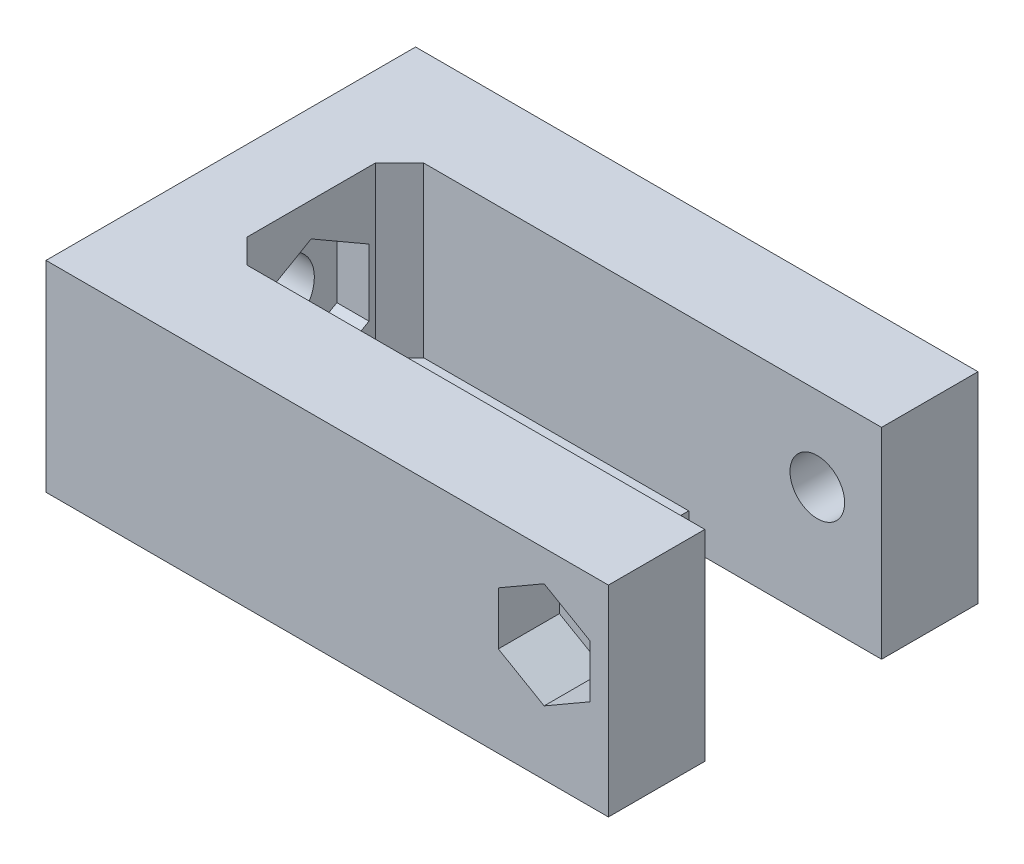
ISO-10303-21;
HEADER;
FILE_DESCRIPTION(('STEP AP214'),'2;1');
FILE_NAME('part.step','',(''),(''),'','','');
FILE_SCHEMA(('AUTOMOTIVE_DESIGN { 1 0 10303 214 1 1 1 1 }'));
ENDSEC;
DATA;
#1=APPLICATION_CONTEXT('core data for automotive mechanical design processes');
#2=APPLICATION_PROTOCOL_DEFINITION('international standard','automotive_design',2000,#1);
#3=PRODUCT_CONTEXT('',#1,'mechanical');
#4=PRODUCT('Part','Part','',(#3));
#5=PRODUCT_RELATED_PRODUCT_CATEGORY('part','',(#4));
#6=PRODUCT_DEFINITION_FORMATION('','',#4);
#7=PRODUCT_DEFINITION_CONTEXT('part definition',#1,'design');
#8=PRODUCT_DEFINITION('design','',#6,#7);
#9=PRODUCT_DEFINITION_SHAPE('','',#8);
#10=(LENGTH_UNIT() NAMED_UNIT(*) SI_UNIT(.MILLI.,.METRE.));
#11=(NAMED_UNIT(*) PLANE_ANGLE_UNIT() SI_UNIT($,.RADIAN.));
#12=(NAMED_UNIT(*) SI_UNIT($,.STERADIAN.) SOLID_ANGLE_UNIT());
#13=UNCERTAINTY_MEASURE_WITH_UNIT(LENGTH_MEASURE(1.E-05),#10,'distance_accuracy_value','');
#14=(GEOMETRIC_REPRESENTATION_CONTEXT(3) GLOBAL_UNCERTAINTY_ASSIGNED_CONTEXT((#13)) GLOBAL_UNIT_ASSIGNED_CONTEXT((#10,
#11,#12)) REPRESENTATION_CONTEXT('',''));
#15=CARTESIAN_POINT('',(0.,0.,0.));
#16=DIRECTION('',(0.,0.,1.));
#17=DIRECTION('',(1.,0.,0.));
#18=AXIS2_PLACEMENT_3D('',#15,#16,#17);
#19=CARTESIAN_POINT('',(5.,0.,0.));
#20=DIRECTION('',(-1.,0.,0.));
#21=DIRECTION('',(0.,0.,1.));
#22=AXIS2_PLACEMENT_3D('',#19,#20,#21);
#23=PLANE('',#22);
#24=DIRECTION('',(0.,-1.,0.));
#25=VECTOR('',#24,1.);
#26=CARTESIAN_POINT('',(5.,8.32846096908265,-7.9));
#27=LINE('',#26,#25);
#28=CARTESIAN_POINT('',(5.,8.32846096908265,-7.9));
#29=VERTEX_POINT('',#28);
#30=CARTESIAN_POINT('',(5.,4.17153903091735,-7.9));
#31=VERTEX_POINT('',#30);
#32=EDGE_CURVE('E301',#29,#31,#27,.T.);
#33=ORIENTED_EDGE('',*,*,#32,.F.);
#34=DIRECTION('',(0.,-0.5,0.866025403784439));
#35=VECTOR('',#34,1.);
#36=CARTESIAN_POINT('',(5.,10.4069219381653,-11.5));
#37=LINE('',#36,#35);
#38=CARTESIAN_POINT('',(5.,10.4069219381653,-11.5));
#39=VERTEX_POINT('',#38);
#40=EDGE_CURVE('E299',#39,#29,#37,.T.);
#41=ORIENTED_EDGE('',*,*,#40,.F.);
#42=DIRECTION('',(0.,0.5,0.866025403784438));
#43=VECTOR('',#42,1.);
#44=CARTESIAN_POINT('',(5.,8.32846096908265,-15.1));
#45=LINE('',#44,#43);
#46=CARTESIAN_POINT('',(5.,8.32846096908265,-15.1));
#47=VERTEX_POINT('',#46);
#48=EDGE_CURVE('E283',#47,#39,#45,.T.);
#49=ORIENTED_EDGE('',*,*,#48,.F.);
#50=DIRECTION('',(0.,1.,0.));
#51=VECTOR('',#50,1.);
#52=CARTESIAN_POINT('',(5.,4.17153903091735,-15.1));
#53=LINE('',#52,#51);
#54=CARTESIAN_POINT('',(5.,4.17153903091735,-15.1));
#55=VERTEX_POINT('',#54);
#56=EDGE_CURVE('E310',#55,#47,#53,.T.);
#57=ORIENTED_EDGE('',*,*,#56,.F.);
#58=DIRECTION('',(0.,0.5,-0.866025403784439));
#59=VECTOR('',#58,1.);
#60=CARTESIAN_POINT('',(5.,2.09307806183469,-11.5));
#61=LINE('',#60,#59);
#62=CARTESIAN_POINT('',(5.,2.09307806183469,-11.5));
#63=VERTEX_POINT('',#62);
#64=EDGE_CURVE('E307',#63,#55,#61,.T.);
#65=ORIENTED_EDGE('',*,*,#64,.F.);
#66=DIRECTION('',(0.,-0.5,-0.866025403784438));
#67=VECTOR('',#66,1.);
#68=CARTESIAN_POINT('',(5.,4.17153903091735,-7.9));
#69=LINE('',#68,#67);
#70=EDGE_CURVE('E304',#31,#63,#69,.T.);
#71=ORIENTED_EDGE('',*,*,#70,.F.);
#72=EDGE_LOOP('',(#33,#41,#49,#57,#65,#71));
#73=FACE_BOUND('',#72,.T.);
#74=DIRECTION('',(0.,0.,1.));
#75=VECTOR('',#74,1.);
#76=CARTESIAN_POINT('',(5.,12.5,-6.));
#77=LINE('',#76,#75);
#78=CARTESIAN_POINT('',(5.,12.5,-15.5));
#79=VERTEX_POINT('',#78);
#80=CARTESIAN_POINT('',(5.,12.5,-7.50000000000001));
#81=VERTEX_POINT('',#80);
#82=EDGE_CURVE('E341',#79,#81,#77,.T.);
#83=ORIENTED_EDGE('',*,*,#82,.T.);
#84=DIRECTION('',(0.,-1.,0.));
#85=VECTOR('',#84,1.);
#86=CARTESIAN_POINT('',(5.,2.,-7.50000000000001));
#87=LINE('',#86,#85);
#88=CARTESIAN_POINT('',(5.,2.,-7.50000000000002));
#89=VERTEX_POINT('',#88);
#90=EDGE_CURVE('E395',#81,#89,#87,.T.);
#91=ORIENTED_EDGE('',*,*,#90,.T.);
#92=DIRECTION('',(0.,0.,1.));
#93=VECTOR('',#92,1.);
#94=CARTESIAN_POINT('',(5.,2.,-35.1107702762748));
#95=LINE('',#94,#93);
#96=CARTESIAN_POINT('',(5.,2.,-15.5));
#97=VERTEX_POINT('',#96);
#98=EDGE_CURVE('E205',#97,#89,#95,.T.);
#99=ORIENTED_EDGE('',*,*,#98,.F.);
#100=DIRECTION('',(0.,1.,0.));
#101=VECTOR('',#100,1.);
#102=CARTESIAN_POINT('',(5.,12.5,-15.5));
#103=LINE('',#102,#101);
#104=EDGE_CURVE('E384',#97,#79,#103,.T.);
#105=ORIENTED_EDGE('',*,*,#104,.T.);
#106=EDGE_LOOP('',(#83,#91,#99,#105));
#107=FACE_BOUND('',#106,.T.);
#108=ADVANCED_FACE('F36',(#73,#107),#23,.F.);
#109=CARTESIAN_POINT('',(-16.6508258053467,12.5,-17.));
#110=DIRECTION('',(0.,0.,-1.));
#111=DIRECTION('',(-1.,0.,0.));
#112=AXIS2_PLACEMENT_3D('',#109,#110,#111);
#113=PLANE('',#112);
#114=CARTESIAN_POINT('',(31.,7.28,-17.));
#115=DIRECTION('',(0.,0.,-1.));
#116=DIRECTION('',(-1.,0.,0.));
#117=AXIS2_PLACEMENT_3D('',#114,#115,#116);
#118=CIRCLE('',#117,1.7);
#119=CARTESIAN_POINT('',(29.3,7.28,-17.));
#120=VERTEX_POINT('',#119);
#121=EDGE_CURVE('E332',#120,#120,#118,.T.);
#122=ORIENTED_EDGE('',*,*,#121,.T.);
#123=EDGE_LOOP('',(#122));
#124=FACE_BOUND('',#123,.T.);
#125=DIRECTION('',(1.,0.,0.));
#126=VECTOR('',#125,1.);
#127=CARTESIAN_POINT('',(-16.6508258053467,12.5,-17.));
#128=LINE('',#127,#126);
#129=CARTESIAN_POINT('',(6.49999999999999,12.5,-17.));
#130=VERTEX_POINT('',#129);
#131=CARTESIAN_POINT('',(35.,12.5,-17.));
#132=VERTEX_POINT('',#131);
#133=EDGE_CURVE('E345',#130,#132,#128,.T.);
#134=ORIENTED_EDGE('',*,*,#133,.F.);
#135=DIRECTION('',(0.,-1.,0.));
#136=VECTOR('',#135,1.);
#137=CARTESIAN_POINT('',(6.49999999999999,2.,-17.));
#138=LINE('',#137,#136);
#139=CARTESIAN_POINT('',(6.49999999999999,2.,-17.));
#140=VERTEX_POINT('',#139);
#141=EDGE_CURVE('E402',#130,#140,#138,.T.);
#142=ORIENTED_EDGE('',*,*,#141,.T.);
#143=DIRECTION('',(1.,0.,0.));
#144=VECTOR('',#143,1.);
#145=CARTESIAN_POINT('',(23.,2.,-17.));
#146=LINE('',#145,#144);
#147=CARTESIAN_POINT('',(23.,2.,-17.));
#148=VERTEX_POINT('',#147);
#149=EDGE_CURVE('E204',#140,#148,#146,.T.);
#150=ORIENTED_EDGE('',*,*,#149,.T.);
#151=DIRECTION('',(0.,-1.,0.));
#152=VECTOR('',#151,1.);
#153=CARTESIAN_POINT('',(23.,0.,-17.));
#154=LINE('',#153,#152);
#155=CARTESIAN_POINT('',(23.,0.,-17.));
#156=VERTEX_POINT('',#155);
#157=EDGE_CURVE('E218',#148,#156,#154,.T.);
#158=ORIENTED_EDGE('',*,*,#157,.T.);
#159=DIRECTION('',(1.,0.,0.));
#160=VECTOR('',#159,1.);
#161=CARTESIAN_POINT('',(-16.6508258053467,0.,-17.));
#162=LINE('',#161,#160);
#163=CARTESIAN_POINT('',(35.,0.,-17.));
#164=VERTEX_POINT('',#163);
#165=EDGE_CURVE('E339',#156,#164,#162,.T.);
#166=ORIENTED_EDGE('',*,*,#165,.T.);
#167=DIRECTION('',(0.,1.,0.));
#168=VECTOR('',#167,1.);
#169=CARTESIAN_POINT('',(35.,12.5,-17.));
#170=LINE('',#169,#168);
#171=EDGE_CURVE('E336',#164,#132,#170,.T.);
#172=ORIENTED_EDGE('',*,*,#171,.T.);
#173=EDGE_LOOP('',(#134,#142,#150,#158,#166,#172));
#174=FACE_BOUND('',#173,.T.);
#175=ADVANCED_FACE('F421',(#124,#174),#113,.F.);
#176=CARTESIAN_POINT('',(-16.6508258053467,12.5,-6.));
#177=DIRECTION('',(0.,0.,1.));
#178=DIRECTION('',(0.,-1.,0.));
#179=AXIS2_PLACEMENT_3D('',#176,#177,#178);
#180=PLANE('',#179);
#181=CARTESIAN_POINT('',(31.,7.27999999999999,-6.));
#182=DIRECTION('',(0.,0.,1.));
#183=DIRECTION('',(0.,-1.,0.));
#184=AXIS2_PLACEMENT_3D('',#181,#182,#183);
#185=CIRCLE('',#184,1.7);
#186=CARTESIAN_POINT('',(31.,5.57999999999999,-6.));
#187=VERTEX_POINT('',#186);
#188=EDGE_CURVE('E331',#187,#187,#185,.T.);
#189=ORIENTED_EDGE('',*,*,#188,.T.);
#190=EDGE_LOOP('',(#189));
#191=FACE_BOUND('',#190,.T.);
#192=DIRECTION('',(1.,0.,0.));
#193=VECTOR('',#192,1.);
#194=CARTESIAN_POINT('',(23.,2.,-6.));
#195=LINE('',#194,#193);
#196=CARTESIAN_POINT('',(6.5,2.,-6.));
#197=VERTEX_POINT('',#196);
#198=CARTESIAN_POINT('',(23.,2.,-6.));
#199=VERTEX_POINT('',#198);
#200=EDGE_CURVE('E195',#197,#199,#195,.T.);
#201=ORIENTED_EDGE('',*,*,#200,.F.);
#202=DIRECTION('',(0.,1.,0.));
#203=VECTOR('',#202,1.);
#204=CARTESIAN_POINT('',(6.5,12.5,-6.));
#205=LINE('',#204,#203);
#206=CARTESIAN_POINT('',(6.5,12.5,-6.));
#207=VERTEX_POINT('',#206);
#208=EDGE_CURVE('E57',#197,#207,#205,.T.);
#209=ORIENTED_EDGE('',*,*,#208,.T.);
#210=DIRECTION('',(1.,0.,0.));
#211=VECTOR('',#210,1.);
#212=CARTESIAN_POINT('',(-16.6508258053467,12.5,-6.));
#213=LINE('',#212,#211);
#214=CARTESIAN_POINT('',(35.,12.5,-6.));
#215=VERTEX_POINT('',#214);
#216=EDGE_CURVE('E344',#207,#215,#213,.T.);
#217=ORIENTED_EDGE('',*,*,#216,.T.);
#218=DIRECTION('',(0.,-1.,0.));
#219=VECTOR('',#218,1.);
#220=CARTESIAN_POINT('',(35.,12.5,-6.));
#221=LINE('',#220,#219);
#222=CARTESIAN_POINT('',(35.,0.,-6.));
#223=VERTEX_POINT('',#222);
#224=EDGE_CURVE('E335',#215,#223,#221,.T.);
#225=ORIENTED_EDGE('',*,*,#224,.T.);
#226=DIRECTION('',(1.,0.,0.));
#227=VECTOR('',#226,1.);
#228=CARTESIAN_POINT('',(-16.6508258053467,0.,-6.));
#229=LINE('',#228,#227);
#230=CARTESIAN_POINT('',(23.,0.,-6.));
#231=VERTEX_POINT('',#230);
#232=EDGE_CURVE('E211',#231,#223,#229,.T.);
#233=ORIENTED_EDGE('',*,*,#232,.F.);
#234=DIRECTION('',(0.,-1.,0.));
#235=VECTOR('',#234,1.);
#236=CARTESIAN_POINT('',(23.,0.,-6.));
#237=LINE('',#236,#235);
#238=EDGE_CURVE('E208',#199,#231,#237,.T.);
#239=ORIENTED_EDGE('',*,*,#238,.F.);
#240=EDGE_LOOP('',(#201,#209,#217,#225,#233,#239));
#241=FACE_BOUND('',#240,.T.);
#242=ADVANCED_FACE('F209',(#191,#241),#180,.F.);
#243=CARTESIAN_POINT('',(31.,7.27999999999999,0.));
#244=DIRECTION('',(0.,0.,-1.));
#245=DIRECTION('',(0.,1.,0.));
#246=AXIS2_PLACEMENT_3D('',#243,#244,#245);
#247=CYLINDRICAL_SURFACE('',#246,1.7);
#248=ORIENTED_EDGE('',*,*,#188,.F.);
#249=EDGE_LOOP('',(#248));
#250=FACE_BOUND('',#249,.T.);
#251=CARTESIAN_POINT('',(31.,7.27999999999999,-3.8));
#252=DIRECTION('',(0.,0.,1.));
#253=DIRECTION('',(1.,0.,0.));
#254=AXIS2_PLACEMENT_3D('',#251,#252,#253);
#255=CIRCLE('',#254,1.7);
#256=CARTESIAN_POINT('',(32.7,7.27999999999999,-3.8));
#257=VERTEX_POINT('',#256);
#258=EDGE_CURVE('E261',#257,#257,#255,.F.);
#259=ORIENTED_EDGE('',*,*,#258,.F.);
#260=EDGE_LOOP('',(#259));
#261=FACE_BOUND('',#260,.T.);
#262=ADVANCED_FACE('F513',(#250,#261),#247,.F.);
#263=ORIENTED_EDGE('',*,*,#121,.F.);
#264=EDGE_LOOP('',(#263));
#265=FACE_BOUND('',#264,.T.);
#266=CARTESIAN_POINT('',(31.,7.28,-20.5));
#267=DIRECTION('',(0.,0.,-1.));
#268=DIRECTION('',(-1.,0.,0.));
#269=AXIS2_PLACEMENT_3D('',#266,#267,#268);
#270=CIRCLE('',#269,1.7);
#271=CARTESIAN_POINT('',(29.3,7.28,-20.5));
#272=VERTEX_POINT('',#271);
#273=EDGE_CURVE('E275',#272,#272,#270,.F.);
#274=ORIENTED_EDGE('',*,*,#273,.F.);
#275=EDGE_LOOP('',(#274));
#276=FACE_BOUND('',#275,.T.);
#277=ADVANCED_FACE('F515',(#265,#276),#247,.F.);
#278=CARTESIAN_POINT('',(10.,6.25,-11.5));
#279=DIRECTION('',(-1.,0.,0.));
#280=DIRECTION('',(0.,0.,1.));
#281=AXIS2_PLACEMENT_3D('',#278,#279,#280);
#282=CYLINDRICAL_SURFACE('',#281,2.2);
#283=CARTESIAN_POINT('',(0.,6.25,-11.5));
#284=DIRECTION('',(-1.,0.,0.));
#285=DIRECTION('',(0.,0.,1.));
#286=AXIS2_PLACEMENT_3D('',#283,#284,#285);
#287=CIRCLE('',#286,2.2);
#288=CARTESIAN_POINT('',(0.,6.25,-9.3));
#289=VERTEX_POINT('',#288);
#290=EDGE_CURVE('E328',#289,#289,#287,.T.);
#291=ORIENTED_EDGE('',*,*,#290,.T.);
#292=EDGE_LOOP('',(#291));
#293=FACE_BOUND('',#292,.T.);
#294=CARTESIAN_POINT('',(3.,6.25,-11.5));
#295=DIRECTION('',(1.,0.,0.));
#296=DIRECTION('',(0.,0.,-1.));
#297=AXIS2_PLACEMENT_3D('',#294,#295,#296);
#298=CIRCLE('',#297,2.2);
#299=CARTESIAN_POINT('',(3.,6.25,-13.7));
#300=VERTEX_POINT('',#299);
#301=EDGE_CURVE('E317',#300,#300,#298,.F.);
#302=ORIENTED_EDGE('',*,*,#301,.F.);
#303=EDGE_LOOP('',(#302));
#304=FACE_BOUND('',#303,.T.);
#305=ADVANCED_FACE('F457',(#293,#304),#282,.F.);
#306=CARTESIAN_POINT('',(35.,0.,0.));
#307=DIRECTION('',(-1.,0.,0.));
#308=DIRECTION('',(0.,0.,1.));
#309=AXIS2_PLACEMENT_3D('',#306,#307,#308);
#310=PLANE('',#309);
#311=DIRECTION('',(0.,0.,1.));
#312=VECTOR('',#311,1.);
#313=CARTESIAN_POINT('',(35.,12.5,0.));
#314=LINE('',#313,#312);
#315=CARTESIAN_POINT('',(35.,12.5,-23.));
#316=VERTEX_POINT('',#315);
#317=EDGE_CURVE('E362',#316,#132,#314,.T.);
#318=ORIENTED_EDGE('',*,*,#317,.T.);
#319=ORIENTED_EDGE('',*,*,#171,.F.);
#320=DIRECTION('',(0.,0.,-1.));
#321=VECTOR('',#320,1.);
#322=CARTESIAN_POINT('',(35.,0.,0.));
#323=LINE('',#322,#321);
#324=CARTESIAN_POINT('',(35.,0.,-23.));
#325=VERTEX_POINT('',#324);
#326=EDGE_CURVE('E354',#164,#325,#323,.T.);
#327=ORIENTED_EDGE('',*,*,#326,.T.);
#328=DIRECTION('',(0.,1.,0.));
#329=VECTOR('',#328,1.);
#330=CARTESIAN_POINT('',(35.,0.,-23.));
#331=LINE('',#330,#329);
#332=EDGE_CURVE('E359',#325,#316,#331,.T.);
#333=ORIENTED_EDGE('',*,*,#332,.T.);
#334=EDGE_LOOP('',(#318,#319,#327,#333));
#335=FACE_BOUND('',#334,.T.);
#336=ADVANCED_FACE('F437',(#335),#310,.F.);
#337=CARTESIAN_POINT('',(35.,0.,0.));
#338=DIRECTION('',(0.,0.,-1.));
#339=DIRECTION('',(0.,1.,0.));
#340=AXIS2_PLACEMENT_3D('',#337,#338,#339);
#341=PLANE('',#340);
#342=DIRECTION('',(0.,-1.,0.));
#343=VECTOR('',#342,1.);
#344=CARTESIAN_POINT('',(28.15,8.92544826719043,0.));
#345=LINE('',#344,#343);
#346=CARTESIAN_POINT('',(28.15,8.92544826719043,0.));
#347=VERTEX_POINT('',#346);
#348=CARTESIAN_POINT('',(28.15,5.63455173280956,0.));
#349=VERTEX_POINT('',#348);
#350=EDGE_CURVE('E245',#347,#349,#345,.T.);
#351=ORIENTED_EDGE('',*,*,#350,.F.);
#352=DIRECTION('',(-0.866025403784439,-0.5,0.));
#353=VECTOR('',#352,1.);
#354=CARTESIAN_POINT('',(31.,10.5708965343809,0.));
#355=LINE('',#354,#353);
#356=CARTESIAN_POINT('',(31.,10.5708965343809,0.));
#357=VERTEX_POINT('',#356);
#358=EDGE_CURVE('E243',#357,#347,#355,.T.);
#359=ORIENTED_EDGE('',*,*,#358,.F.);
#360=DIRECTION('',(-0.866025403784439,0.5,0.));
#361=VECTOR('',#360,1.);
#362=CARTESIAN_POINT('',(33.85,8.92544826719043,0.));
#363=LINE('',#362,#361);
#364=CARTESIAN_POINT('',(33.85,8.92544826719043,0.));
#365=VERTEX_POINT('',#364);
#366=EDGE_CURVE('E227',#365,#357,#363,.T.);
#367=ORIENTED_EDGE('',*,*,#366,.F.);
#368=DIRECTION('',(0.,1.,0.));
#369=VECTOR('',#368,1.);
#370=CARTESIAN_POINT('',(33.85,5.63455173280956,0.));
#371=LINE('',#370,#369);
#372=CARTESIAN_POINT('',(33.85,5.63455173280956,0.));
#373=VERTEX_POINT('',#372);
#374=EDGE_CURVE('E254',#373,#365,#371,.T.);
#375=ORIENTED_EDGE('',*,*,#374,.F.);
#376=DIRECTION('',(0.866025403784439,0.5,0.));
#377=VECTOR('',#376,1.);
#378=CARTESIAN_POINT('',(31.,3.98910346561913,0.));
#379=LINE('',#378,#377);
#380=CARTESIAN_POINT('',(31.,3.98910346561913,0.));
#381=VERTEX_POINT('',#380);
#382=EDGE_CURVE('E251',#381,#373,#379,.T.);
#383=ORIENTED_EDGE('',*,*,#382,.F.);
#384=DIRECTION('',(0.866025403784439,-0.5,0.));
#385=VECTOR('',#384,1.);
#386=CARTESIAN_POINT('',(28.15,5.63455173280956,0.));
#387=LINE('',#386,#385);
#388=EDGE_CURVE('E248',#349,#381,#387,.T.);
#389=ORIENTED_EDGE('',*,*,#388,.F.);
#390=EDGE_LOOP('',(#351,#359,#367,#375,#383,#389));
#391=FACE_BOUND('',#390,.T.);
#392=DIRECTION('',(0.,-1.,0.));
#393=VECTOR('',#392,1.);
#394=CARTESIAN_POINT('',(0.,0.,0.));
#395=LINE('',#394,#393);
#396=CARTESIAN_POINT('',(0.,12.5,0.));
#397=VERTEX_POINT('',#396);
#398=CARTESIAN_POINT('',(0.,0.,0.));
#399=VERTEX_POINT('',#398);
#400=EDGE_CURVE('E350',#397,#399,#395,.T.);
#401=ORIENTED_EDGE('',*,*,#400,.T.);
#402=DIRECTION('',(-1.,0.,0.));
#403=VECTOR('',#402,1.);
#404=CARTESIAN_POINT('',(35.,0.,0.));
#405=LINE('',#404,#403);
#406=CARTESIAN_POINT('',(35.,0.,0.));
#407=VERTEX_POINT('',#406);
#408=EDGE_CURVE('E381',#407,#399,#405,.T.);
#409=ORIENTED_EDGE('',*,*,#408,.F.);
#410=DIRECTION('',(0.,-1.,0.));
#411=VECTOR('',#410,1.);
#412=CARTESIAN_POINT('',(35.,0.,0.));
#413=LINE('',#412,#411);
#414=CARTESIAN_POINT('',(35.,12.5,0.));
#415=VERTEX_POINT('',#414);
#416=EDGE_CURVE('E351',#415,#407,#413,.T.);
#417=ORIENTED_EDGE('',*,*,#416,.F.);
#418=DIRECTION('',(-1.,0.,0.));
#419=VECTOR('',#418,1.);
#420=CARTESIAN_POINT('',(35.,12.5,0.));
#421=LINE('',#420,#419);
#422=EDGE_CURVE('E365',#415,#397,#421,.T.);
#423=ORIENTED_EDGE('',*,*,#422,.T.);
#424=EDGE_LOOP('',(#401,#409,#417,#423));
#425=FACE_BOUND('',#424,.T.);
#426=ADVANCED_FACE('F450',(#391,#425),#341,.F.);
#427=CARTESIAN_POINT('',(35.,0.,0.));
#428=DIRECTION('',(0.,1.,0.));
#429=DIRECTION('',(0.,0.,1.));
#430=AXIS2_PLACEMENT_3D('',#427,#428,#429);
#431=PLANE('',#430);
#432=ORIENTED_EDGE('',*,*,#165,.F.);
#433=DIRECTION('',(0.,0.,1.));
#434=VECTOR('',#433,1.);
#435=CARTESIAN_POINT('',(23.,0.,-35.1107702762748));
#436=LINE('',#435,#434);
#437=EDGE_CURVE('E215',#156,#231,#436,.T.);
#438=ORIENTED_EDGE('',*,*,#437,.T.);
#439=ORIENTED_EDGE('',*,*,#232,.T.);
#440=EDGE_CURVE('E356',#407,#223,#323,.T.);
#441=ORIENTED_EDGE('',*,*,#440,.F.);
#442=ORIENTED_EDGE('',*,*,#408,.T.);
#443=DIRECTION('',(0.,0.,-1.));
#444=VECTOR('',#443,1.);
#445=CARTESIAN_POINT('',(0.,0.,0.));
#446=LINE('',#445,#444);
#447=CARTESIAN_POINT('',(0.,0.,-23.));
#448=VERTEX_POINT('',#447);
#449=EDGE_CURVE('E368',#399,#448,#446,.T.);
#450=ORIENTED_EDGE('',*,*,#449,.T.);
#451=DIRECTION('',(-1.,0.,0.));
#452=VECTOR('',#451,1.);
#453=CARTESIAN_POINT('',(35.,0.,-23.));
#454=LINE('',#453,#452);
#455=EDGE_CURVE('E378',#325,#448,#454,.T.);
#456=ORIENTED_EDGE('',*,*,#455,.F.);
#457=ORIENTED_EDGE('',*,*,#326,.F.);
#458=EDGE_LOOP('',(#432,#438,#439,#441,#442,#450,#456,#457));
#459=FACE_BOUND('',#458,.T.);
#460=ADVANCED_FACE('F447',(#459),#431,.F.);
#461=CARTESIAN_POINT('',(35.,0.,-23.));
#462=DIRECTION('',(0.,0.,1.));
#463=DIRECTION('',(0.,-1.,0.));
#464=AXIS2_PLACEMENT_3D('',#461,#462,#463);
#465=PLANE('',#464);
#466=CARTESIAN_POINT('',(31.,7.28,-23.));
#467=DIRECTION('',(0.,0.,-1.));
#468=DIRECTION('',(-1.,0.,0.));
#469=AXIS2_PLACEMENT_3D('',#466,#467,#468);
#470=CIRCLE('',#469,3.25);
#471=CARTESIAN_POINT('',(27.75,7.28,-23.));
#472=VERTEX_POINT('',#471);
#473=EDGE_CURVE('E276',#472,#472,#470,.T.);
#474=ORIENTED_EDGE('',*,*,#473,.F.);
#475=EDGE_LOOP('',(#474));
#476=FACE_BOUND('',#475,.T.);
#477=DIRECTION('',(0.,1.,0.));
#478=VECTOR('',#477,1.);
#479=CARTESIAN_POINT('',(0.,0.,-23.));
#480=LINE('',#479,#478);
#481=CARTESIAN_POINT('',(0.,12.5,-23.));
#482=VERTEX_POINT('',#481);
#483=EDGE_CURVE('E370',#448,#482,#480,.T.);
#484=ORIENTED_EDGE('',*,*,#483,.T.);
#485=DIRECTION('',(-1.,0.,0.));
#486=VECTOR('',#485,1.);
#487=CARTESIAN_POINT('',(35.,12.5,-23.));
#488=LINE('',#487,#486);
#489=EDGE_CURVE('E375',#316,#482,#488,.T.);
#490=ORIENTED_EDGE('',*,*,#489,.F.);
#491=ORIENTED_EDGE('',*,*,#332,.F.);
#492=ORIENTED_EDGE('',*,*,#455,.T.);
#493=EDGE_LOOP('',(#484,#490,#491,#492));
#494=FACE_BOUND('',#493,.T.);
#495=ADVANCED_FACE('F444',(#476,#494),#465,.F.);
#496=CARTESIAN_POINT('',(35.,12.5,0.));
#497=DIRECTION('',(0.,-1.,0.));
#498=DIRECTION('',(0.,0.,-1.));
#499=AXIS2_PLACEMENT_3D('',#496,#497,#498);
#500=PLANE('',#499);
#501=ORIENTED_EDGE('',*,*,#82,.F.);
#502=DIRECTION('',(-0.707106781186544,0.,0.707106781186551));
#503=VECTOR('',#502,1.);
#504=CARTESIAN_POINT('',(12.2499999999999,12.5,-22.7499999999999));
#505=LINE('',#504,#503);
#506=EDGE_CURVE('E12',#79,#130,#505,.F.);
#507=ORIENTED_EDGE('',*,*,#506,.T.);
#508=ORIENTED_EDGE('',*,*,#133,.T.);
#509=ORIENTED_EDGE('',*,*,#317,.F.);
#510=ORIENTED_EDGE('',*,*,#489,.T.);
#511=DIRECTION('',(0.,0.,1.));
#512=VECTOR('',#511,1.);
#513=CARTESIAN_POINT('',(0.,12.5,0.));
#514=LINE('',#513,#512);
#515=EDGE_CURVE('E355',#482,#397,#514,.T.);
#516=ORIENTED_EDGE('',*,*,#515,.T.);
#517=ORIENTED_EDGE('',*,*,#422,.F.);
#518=EDGE_CURVE('E361',#215,#415,#314,.T.);
#519=ORIENTED_EDGE('',*,*,#518,.F.);
#520=ORIENTED_EDGE('',*,*,#216,.F.);
#521=DIRECTION('',(0.707106781186544,0.,0.707106781186551));
#522=VECTOR('',#521,1.);
#523=CARTESIAN_POINT('',(23.7499999999999,12.5,11.25));
#524=LINE('',#523,#522);
#525=EDGE_CURVE('E44',#207,#81,#524,.F.);
#526=ORIENTED_EDGE('',*,*,#525,.T.);
#527=EDGE_LOOP('',(#501,#507,#508,#509,#510,#516,#517,#519,#520,#526));
#528=FACE_BOUND('',#527,.T.);
#529=ADVANCED_FACE('F404',(#528),#500,.F.);
#530=ORIENTED_EDGE('',*,*,#440,.T.);
#531=ORIENTED_EDGE('',*,*,#224,.F.);
#532=ORIENTED_EDGE('',*,*,#518,.T.);
#533=ORIENTED_EDGE('',*,*,#416,.T.);
#534=EDGE_LOOP('',(#530,#531,#532,#533));
#535=FACE_BOUND('',#534,.T.);
#536=ADVANCED_FACE('F432',(#535),#310,.F.);
#537=CARTESIAN_POINT('',(0.,0.,0.));
#538=DIRECTION('',(-1.,0.,0.));
#539=DIRECTION('',(0.,0.,1.));
#540=AXIS2_PLACEMENT_3D('',#537,#538,#539);
#541=PLANE('',#540);
#542=ORIENTED_EDGE('',*,*,#290,.F.);
#543=EDGE_LOOP('',(#542));
#544=FACE_BOUND('',#543,.T.);
#545=ORIENTED_EDGE('',*,*,#400,.F.);
#546=ORIENTED_EDGE('',*,*,#515,.F.);
#547=ORIENTED_EDGE('',*,*,#483,.F.);
#548=ORIENTED_EDGE('',*,*,#449,.F.);
#549=EDGE_LOOP('',(#545,#546,#547,#548));
#550=FACE_BOUND('',#549,.T.);
#551=ADVANCED_FACE('F435',(#544,#550),#541,.T.);
#552=CARTESIAN_POINT('',(3.,0.,0.));
#553=DIRECTION('',(1.,0.,0.));
#554=DIRECTION('',(0.,0.,-1.));
#555=AXIS2_PLACEMENT_3D('',#552,#553,#554);
#556=PLANE('',#555);
#557=DIRECTION('',(0.,-0.5,0.866025403784439));
#558=VECTOR('',#557,1.);
#559=CARTESIAN_POINT('',(3.,10.4069219381653,-11.5));
#560=LINE('',#559,#558);
#561=CARTESIAN_POINT('',(3.,10.4069219381653,-11.5));
#562=VERTEX_POINT('',#561);
#563=CARTESIAN_POINT('',(3.,8.32846096908265,-7.9));
#564=VERTEX_POINT('',#563);
#565=EDGE_CURVE('E279',#562,#564,#560,.T.);
#566=ORIENTED_EDGE('',*,*,#565,.T.);
#567=DIRECTION('',(0.,-1.,0.));
#568=VECTOR('',#567,1.);
#569=CARTESIAN_POINT('',(3.,8.32846096908265,-7.9));
#570=LINE('',#569,#568);
#571=CARTESIAN_POINT('',(3.,4.17153903091735,-7.9));
#572=VERTEX_POINT('',#571);
#573=EDGE_CURVE('E282',#564,#572,#570,.T.);
#574=ORIENTED_EDGE('',*,*,#573,.T.);
#575=DIRECTION('',(0.,-0.5,-0.866025403784438));
#576=VECTOR('',#575,1.);
#577=CARTESIAN_POINT('',(3.,4.17153903091735,-7.9));
#578=LINE('',#577,#576);
#579=CARTESIAN_POINT('',(3.,2.09307806183469,-11.5));
#580=VERTEX_POINT('',#579);
#581=EDGE_CURVE('E286',#572,#580,#578,.T.);
#582=ORIENTED_EDGE('',*,*,#581,.T.);
#583=DIRECTION('',(0.,0.5,-0.866025403784439));
#584=VECTOR('',#583,1.);
#585=CARTESIAN_POINT('',(3.,2.09307806183469,-11.5));
#586=LINE('',#585,#584);
#587=CARTESIAN_POINT('',(3.,4.17153903091735,-15.1));
#588=VERTEX_POINT('',#587);
#589=EDGE_CURVE('E289',#580,#588,#586,.T.);
#590=ORIENTED_EDGE('',*,*,#589,.T.);
#591=DIRECTION('',(0.,1.,0.));
#592=VECTOR('',#591,1.);
#593=CARTESIAN_POINT('',(3.,4.17153903091735,-15.1));
#594=LINE('',#593,#592);
#595=CARTESIAN_POINT('',(3.,8.32846096908265,-15.1));
#596=VERTEX_POINT('',#595);
#597=EDGE_CURVE('E292',#588,#596,#594,.T.);
#598=ORIENTED_EDGE('',*,*,#597,.T.);
#599=DIRECTION('',(0.,0.5,0.866025403784438));
#600=VECTOR('',#599,1.);
#601=CARTESIAN_POINT('',(3.,8.32846096908265,-15.1));
#602=LINE('',#601,#600);
#603=EDGE_CURVE('E295',#596,#562,#602,.T.);
#604=ORIENTED_EDGE('',*,*,#603,.T.);
#605=EDGE_LOOP('',(#566,#574,#582,#590,#598,#604));
#606=FACE_BOUND('',#605,.T.);
#607=ORIENTED_EDGE('',*,*,#301,.T.);
#608=EDGE_LOOP('',(#607));
#609=FACE_BOUND('',#608,.T.);
#610=ADVANCED_FACE('F440',(#606,#609),#556,.T.);
#611=CARTESIAN_POINT('',(3.,10.4069219381653,-11.5));
#612=DIRECTION('',(0.,0.866025403784439,0.5));
#613=DIRECTION('',(0.,-0.5,0.866025403784439));
#614=AXIS2_PLACEMENT_3D('',#611,#612,#613);
#615=PLANE('',#614);
#616=ORIENTED_EDGE('',*,*,#40,.T.);
#617=DIRECTION('',(1.,0.,0.));
#618=VECTOR('',#617,1.);
#619=CARTESIAN_POINT('',(3.,8.32846096908265,-7.9));
#620=LINE('',#619,#618);
#621=EDGE_CURVE('E298',#564,#29,#620,.T.);
#622=ORIENTED_EDGE('',*,*,#621,.F.);
#623=ORIENTED_EDGE('',*,*,#565,.F.);
#624=DIRECTION('',(1.,0.,0.));
#625=VECTOR('',#624,1.);
#626=CARTESIAN_POINT('',(3.,10.4069219381653,-11.5));
#627=LINE('',#626,#625);
#628=EDGE_CURVE('E315',#562,#39,#627,.T.);
#629=ORIENTED_EDGE('',*,*,#628,.T.);
#630=EDGE_LOOP('',(#616,#622,#623,#629));
#631=FACE_BOUND('',#630,.T.);
#632=ADVANCED_FACE('F529',(#631),#615,.F.);
#633=CARTESIAN_POINT('',(3.,8.32846096908265,-15.1));
#634=DIRECTION('',(0.,0.866025403784439,-0.5));
#635=DIRECTION('',(0.,0.5,0.866025403784438));
#636=AXIS2_PLACEMENT_3D('',#633,#634,#635);
#637=PLANE('',#636);
#638=ORIENTED_EDGE('',*,*,#48,.T.);
#639=ORIENTED_EDGE('',*,*,#628,.F.);
#640=ORIENTED_EDGE('',*,*,#603,.F.);
#641=DIRECTION('',(1.,0.,0.));
#642=VECTOR('',#641,1.);
#643=CARTESIAN_POINT('',(3.,8.32846096908265,-15.1));
#644=LINE('',#643,#642);
#645=EDGE_CURVE('E318',#596,#47,#644,.T.);
#646=ORIENTED_EDGE('',*,*,#645,.T.);
#647=EDGE_LOOP('',(#638,#639,#640,#646));
#648=FACE_BOUND('',#647,.T.);
#649=ADVANCED_FACE('F532',(#648),#637,.F.);
#650=CARTESIAN_POINT('',(3.,4.17153903091735,-15.1));
#651=DIRECTION('',(0.,0.,-1.));
#652=DIRECTION('',(0.,1.,0.));
#653=AXIS2_PLACEMENT_3D('',#650,#651,#652);
#654=PLANE('',#653);
#655=ORIENTED_EDGE('',*,*,#56,.T.);
#656=ORIENTED_EDGE('',*,*,#645,.F.);
#657=ORIENTED_EDGE('',*,*,#597,.F.);
#658=DIRECTION('',(1.,0.,0.));
#659=VECTOR('',#658,1.);
#660=CARTESIAN_POINT('',(3.,4.17153903091735,-15.1));
#661=LINE('',#660,#659);
#662=EDGE_CURVE('E320',#588,#55,#661,.T.);
#663=ORIENTED_EDGE('',*,*,#662,.T.);
#664=EDGE_LOOP('',(#655,#656,#657,#663));
#665=FACE_BOUND('',#664,.T.);
#666=ADVANCED_FACE('F546',(#665),#654,.F.);
#667=CARTESIAN_POINT('',(3.,2.09307806183469,-11.5));
#668=DIRECTION('',(0.,-0.866025403784439,-0.5));
#669=DIRECTION('',(0.,0.5,-0.866025403784439));
#670=AXIS2_PLACEMENT_3D('',#667,#668,#669);
#671=PLANE('',#670);
#672=ORIENTED_EDGE('',*,*,#64,.T.);
#673=ORIENTED_EDGE('',*,*,#662,.F.);
#674=ORIENTED_EDGE('',*,*,#589,.F.);
#675=DIRECTION('',(1.,0.,0.));
#676=VECTOR('',#675,1.);
#677=CARTESIAN_POINT('',(3.,2.09307806183469,-11.5));
#678=LINE('',#677,#676);
#679=EDGE_CURVE('E322',#580,#63,#678,.T.);
#680=ORIENTED_EDGE('',*,*,#679,.T.);
#681=EDGE_LOOP('',(#672,#673,#674,#680));
#682=FACE_BOUND('',#681,.T.);
#683=ADVANCED_FACE('F542',(#682),#671,.F.);
#684=CARTESIAN_POINT('',(3.,4.17153903091735,-7.9));
#685=DIRECTION('',(0.,-0.866025403784439,0.5));
#686=DIRECTION('',(0.,-0.5,-0.866025403784438));
#687=AXIS2_PLACEMENT_3D('',#684,#685,#686);
#688=PLANE('',#687);
#689=ORIENTED_EDGE('',*,*,#70,.T.);
#690=ORIENTED_EDGE('',*,*,#679,.F.);
#691=ORIENTED_EDGE('',*,*,#581,.F.);
#692=DIRECTION('',(1.,0.,0.));
#693=VECTOR('',#692,1.);
#694=CARTESIAN_POINT('',(3.,4.17153903091735,-7.9));
#695=LINE('',#694,#693);
#696=EDGE_CURVE('E324',#572,#31,#695,.T.);
#697=ORIENTED_EDGE('',*,*,#696,.T.);
#698=EDGE_LOOP('',(#689,#690,#691,#697));
#699=FACE_BOUND('',#698,.T.);
#700=ADVANCED_FACE('F538',(#699),#688,.F.);
#701=CARTESIAN_POINT('',(3.,8.32846096908265,-7.9));
#702=DIRECTION('',(0.,0.,1.));
#703=DIRECTION('',(0.,-1.,0.));
#704=AXIS2_PLACEMENT_3D('',#701,#702,#703);
#705=PLANE('',#704);
#706=ORIENTED_EDGE('',*,*,#32,.T.);
#707=ORIENTED_EDGE('',*,*,#696,.F.);
#708=ORIENTED_EDGE('',*,*,#573,.F.);
#709=ORIENTED_EDGE('',*,*,#621,.T.);
#710=EDGE_LOOP('',(#706,#707,#708,#709));
#711=FACE_BOUND('',#710,.T.);
#712=ADVANCED_FACE('F534',(#711),#705,.F.);
#713=CARTESIAN_POINT('',(31.,7.28,-20.5));
#714=DIRECTION('',(0.,0.,-1.));
#715=DIRECTION('',(-1.,0.,0.));
#716=AXIS2_PLACEMENT_3D('',#713,#714,#715);
#717=PLANE('',#716);
#718=CARTESIAN_POINT('',(31.,7.28,-20.5));
#719=DIRECTION('',(0.,0.,-1.));
#720=DIRECTION('',(-1.,0.,0.));
#721=AXIS2_PLACEMENT_3D('',#718,#719,#720);
#722=CIRCLE('',#721,3.25);
#723=CARTESIAN_POINT('',(27.75,7.28,-20.5));
#724=VERTEX_POINT('',#723);
#725=EDGE_CURVE('E272',#724,#724,#722,.T.);
#726=ORIENTED_EDGE('',*,*,#725,.T.);
#727=EDGE_LOOP('',(#726));
#728=FACE_BOUND('',#727,.T.);
#729=ORIENTED_EDGE('',*,*,#273,.T.);
#730=EDGE_LOOP('',(#729));
#731=FACE_BOUND('',#730,.T.);
#732=ADVANCED_FACE('F537',(#728,#731),#717,.T.);
#733=CARTESIAN_POINT('',(31.,7.28,-20.5));
#734=DIRECTION('',(0.,0.,-1.));
#735=DIRECTION('',(-1.,0.,0.));
#736=AXIS2_PLACEMENT_3D('',#733,#734,#735);
#737=CYLINDRICAL_SURFACE('',#736,3.25);
#738=ORIENTED_EDGE('',*,*,#725,.F.);
#739=EDGE_LOOP('',(#738));
#740=FACE_BOUND('',#739,.T.);
#741=ORIENTED_EDGE('',*,*,#473,.T.);
#742=EDGE_LOOP('',(#741));
#743=FACE_BOUND('',#742,.T.);
#744=ADVANCED_FACE('F509',(#740,#743),#737,.F.);
#745=CARTESIAN_POINT('',(0.,0.,-3.8));
#746=DIRECTION('',(0.,0.,1.));
#747=DIRECTION('',(1.,0.,0.));
#748=AXIS2_PLACEMENT_3D('',#745,#746,#747);
#749=PLANE('',#748);
#750=DIRECTION('',(-0.866025403784439,-0.5,0.));
#751=VECTOR('',#750,1.);
#752=CARTESIAN_POINT('',(31.,10.5708965343809,-3.8));
#753=LINE('',#752,#751);
#754=CARTESIAN_POINT('',(31.,10.5708965343809,-3.8));
#755=VERTEX_POINT('',#754);
#756=CARTESIAN_POINT('',(28.15,8.92544826719043,-3.8));
#757=VERTEX_POINT('',#756);
#758=EDGE_CURVE('E223',#755,#757,#753,.T.);
#759=ORIENTED_EDGE('',*,*,#758,.T.);
#760=DIRECTION('',(0.,-1.,0.));
#761=VECTOR('',#760,1.);
#762=CARTESIAN_POINT('',(28.15,8.92544826719043,-3.8));
#763=LINE('',#762,#761);
#764=CARTESIAN_POINT('',(28.15,5.63455173280956,-3.8));
#765=VERTEX_POINT('',#764);
#766=EDGE_CURVE('E226',#757,#765,#763,.T.);
#767=ORIENTED_EDGE('',*,*,#766,.T.);
#768=DIRECTION('',(0.866025403784439,-0.5,0.));
#769=VECTOR('',#768,1.);
#770=CARTESIAN_POINT('',(28.15,5.63455173280956,-3.8));
#771=LINE('',#770,#769);
#772=CARTESIAN_POINT('',(31.,3.98910346561913,-3.8));
#773=VERTEX_POINT('',#772);
#774=EDGE_CURVE('E230',#765,#773,#771,.T.);
#775=ORIENTED_EDGE('',*,*,#774,.T.);
#776=DIRECTION('',(0.866025403784439,0.5,0.));
#777=VECTOR('',#776,1.);
#778=CARTESIAN_POINT('',(31.,3.98910346561913,-3.8));
#779=LINE('',#778,#777);
#780=CARTESIAN_POINT('',(33.85,5.63455173280956,-3.8));
#781=VERTEX_POINT('',#780);
#782=EDGE_CURVE('E233',#773,#781,#779,.T.);
#783=ORIENTED_EDGE('',*,*,#782,.T.);
#784=DIRECTION('',(0.,1.,0.));
#785=VECTOR('',#784,1.);
#786=CARTESIAN_POINT('',(33.85,5.63455173280956,-3.8));
#787=LINE('',#786,#785);
#788=CARTESIAN_POINT('',(33.85,8.92544826719043,-3.8));
#789=VERTEX_POINT('',#788);
#790=EDGE_CURVE('E236',#781,#789,#787,.T.);
#791=ORIENTED_EDGE('',*,*,#790,.T.);
#792=DIRECTION('',(-0.866025403784439,0.5,0.));
#793=VECTOR('',#792,1.);
#794=CARTESIAN_POINT('',(33.85,8.92544826719043,-3.8));
#795=LINE('',#794,#793);
#796=EDGE_CURVE('E239',#789,#755,#795,.T.);
#797=ORIENTED_EDGE('',*,*,#796,.T.);
#798=EDGE_LOOP('',(#759,#767,#775,#783,#791,#797));
#799=FACE_BOUND('',#798,.T.);
#800=ORIENTED_EDGE('',*,*,#258,.T.);
#801=EDGE_LOOP('',(#800));
#802=FACE_BOUND('',#801,.T.);
#803=ADVANCED_FACE('F506',(#799,#802),#749,.T.);
#804=CARTESIAN_POINT('',(31.,10.5708965343809,-3.8));
#805=DIRECTION('',(-0.5,0.866025403784438,0.));
#806=DIRECTION('',(-0.866025403784439,-0.5,0.));
#807=AXIS2_PLACEMENT_3D('',#804,#805,#806);
#808=PLANE('',#807);
#809=ORIENTED_EDGE('',*,*,#358,.T.);
#810=DIRECTION('',(0.,0.,1.));
#811=VECTOR('',#810,1.);
#812=CARTESIAN_POINT('',(28.15,8.92544826719043,-3.8));
#813=LINE('',#812,#811);
#814=EDGE_CURVE('E242',#757,#347,#813,.T.);
#815=ORIENTED_EDGE('',*,*,#814,.F.);
#816=ORIENTED_EDGE('',*,*,#758,.F.);
#817=DIRECTION('',(0.,0.,1.));
#818=VECTOR('',#817,1.);
#819=CARTESIAN_POINT('',(31.,10.5708965343809,-3.8));
#820=LINE('',#819,#818);
#821=EDGE_CURVE('E259',#755,#357,#820,.T.);
#822=ORIENTED_EDGE('',*,*,#821,.T.);
#823=EDGE_LOOP('',(#809,#815,#816,#822));
#824=FACE_BOUND('',#823,.T.);
#825=ADVANCED_FACE('F492',(#824),#808,.F.);
#826=CARTESIAN_POINT('',(33.85,8.92544826719043,-3.8));
#827=DIRECTION('',(0.5,0.866025403784438,0.));
#828=DIRECTION('',(-0.866025403784439,0.5,0.));
#829=AXIS2_PLACEMENT_3D('',#826,#827,#828);
#830=PLANE('',#829);
#831=ORIENTED_EDGE('',*,*,#366,.T.);
#832=ORIENTED_EDGE('',*,*,#821,.F.);
#833=ORIENTED_EDGE('',*,*,#796,.F.);
#834=DIRECTION('',(0.,0.,1.));
#835=VECTOR('',#834,1.);
#836=CARTESIAN_POINT('',(33.85,8.92544826719043,-3.8));
#837=LINE('',#836,#835);
#838=EDGE_CURVE('E262',#789,#365,#837,.T.);
#839=ORIENTED_EDGE('',*,*,#838,.T.);
#840=EDGE_LOOP('',(#831,#832,#833,#839));
#841=FACE_BOUND('',#840,.T.);
#842=ADVANCED_FACE('F495',(#841),#830,.F.);
#843=CARTESIAN_POINT('',(33.85,5.63455173280956,-3.8));
#844=DIRECTION('',(1.,0.,0.));
#845=DIRECTION('',(0.,0.,-1.));
#846=AXIS2_PLACEMENT_3D('',#843,#844,#845);
#847=PLANE('',#846);
#848=ORIENTED_EDGE('',*,*,#374,.T.);
#849=ORIENTED_EDGE('',*,*,#838,.F.);
#850=ORIENTED_EDGE('',*,*,#790,.F.);
#851=DIRECTION('',(0.,0.,1.));
#852=VECTOR('',#851,1.);
#853=CARTESIAN_POINT('',(33.85,5.63455173280956,-3.8));
#854=LINE('',#853,#852);
#855=EDGE_CURVE('E264',#781,#373,#854,.T.);
#856=ORIENTED_EDGE('',*,*,#855,.T.);
#857=EDGE_LOOP('',(#848,#849,#850,#856));
#858=FACE_BOUND('',#857,.T.);
#859=ADVANCED_FACE('F498',(#858),#847,.F.);
#860=CARTESIAN_POINT('',(31.,3.98910346561913,-3.8));
#861=DIRECTION('',(0.5,-0.866025403784439,0.));
#862=DIRECTION('',(0.866025403784439,0.5,0.));
#863=AXIS2_PLACEMENT_3D('',#860,#861,#862);
#864=PLANE('',#863);
#865=ORIENTED_EDGE('',*,*,#382,.T.);
#866=ORIENTED_EDGE('',*,*,#855,.F.);
#867=ORIENTED_EDGE('',*,*,#782,.F.);
#868=DIRECTION('',(0.,0.,1.));
#869=VECTOR('',#868,1.);
#870=CARTESIAN_POINT('',(31.,3.98910346561913,-3.8));
#871=LINE('',#870,#869);
#872=EDGE_CURVE('E266',#773,#381,#871,.T.);
#873=ORIENTED_EDGE('',*,*,#872,.T.);
#874=EDGE_LOOP('',(#865,#866,#867,#873));
#875=FACE_BOUND('',#874,.T.);
#876=ADVANCED_FACE('F502',(#875),#864,.F.);
#877=CARTESIAN_POINT('',(28.15,5.63455173280956,-3.8));
#878=DIRECTION('',(-0.5,-0.866025403784438,0.));
#879=DIRECTION('',(0.866025403784439,-0.5,0.));
#880=AXIS2_PLACEMENT_3D('',#877,#878,#879);
#881=PLANE('',#880);
#882=ORIENTED_EDGE('',*,*,#388,.T.);
#883=ORIENTED_EDGE('',*,*,#872,.F.);
#884=ORIENTED_EDGE('',*,*,#774,.F.);
#885=DIRECTION('',(0.,0.,1.));
#886=VECTOR('',#885,1.);
#887=CARTESIAN_POINT('',(28.15,5.63455173280956,-3.8));
#888=LINE('',#887,#886);
#889=EDGE_CURVE('E268',#765,#349,#888,.T.);
#890=ORIENTED_EDGE('',*,*,#889,.T.);
#891=EDGE_LOOP('',(#882,#883,#884,#890));
#892=FACE_BOUND('',#891,.T.);
#893=ADVANCED_FACE('F504',(#892),#881,.F.);
#894=CARTESIAN_POINT('',(28.15,8.92544826719043,-3.8));
#895=DIRECTION('',(-1.,0.,0.));
#896=DIRECTION('',(0.,0.,1.));
#897=AXIS2_PLACEMENT_3D('',#894,#895,#896);
#898=PLANE('',#897);
#899=ORIENTED_EDGE('',*,*,#350,.T.);
#900=ORIENTED_EDGE('',*,*,#889,.F.);
#901=ORIENTED_EDGE('',*,*,#766,.F.);
#902=ORIENTED_EDGE('',*,*,#814,.T.);
#903=EDGE_LOOP('',(#899,#900,#901,#902));
#904=FACE_BOUND('',#903,.T.);
#905=ADVANCED_FACE('F487',(#904),#898,.F.);
#906=CARTESIAN_POINT('',(23.,0.,-35.1107702762748));
#907=DIRECTION('',(-1.,0.,0.));
#908=DIRECTION('',(0.,0.,1.));
#909=AXIS2_PLACEMENT_3D('',#906,#907,#908);
#910=PLANE('',#909);
#911=ORIENTED_EDGE('',*,*,#157,.F.);
#912=DIRECTION('',(0.,0.,1.));
#913=VECTOR('',#912,1.);
#914=CARTESIAN_POINT('',(23.,2.,-35.1107702762748));
#915=LINE('',#914,#913);
#916=EDGE_CURVE('E201',#148,#199,#915,.T.);
#917=ORIENTED_EDGE('',*,*,#916,.T.);
#918=ORIENTED_EDGE('',*,*,#238,.T.);
#919=ORIENTED_EDGE('',*,*,#437,.F.);
#920=EDGE_LOOP('',(#911,#917,#918,#919));
#921=FACE_BOUND('',#920,.T.);
#922=ADVANCED_FACE('F217',(#921),#910,.F.);
#923=CARTESIAN_POINT('',(23.,2.,-35.1107702762748));
#924=DIRECTION('',(0.,-1.,0.));
#925=DIRECTION('',(0.,0.,-1.));
#926=AXIS2_PLACEMENT_3D('',#923,#924,#925);
#927=PLANE('',#926);
#928=ORIENTED_EDGE('',*,*,#98,.T.);
#929=DIRECTION('',(-0.707106781186544,0.,-0.707106781186551));
#930=VECTOR('',#929,1.);
#931=CARTESIAN_POINT('',(5.,2.,-7.50000000000001));
#932=LINE('',#931,#930);
#933=EDGE_CURVE('E203',#89,#197,#932,.F.);
#934=ORIENTED_EDGE('',*,*,#933,.T.);
#935=ORIENTED_EDGE('',*,*,#200,.T.);
#936=ORIENTED_EDGE('',*,*,#916,.F.);
#937=ORIENTED_EDGE('',*,*,#149,.F.);
#938=DIRECTION('',(0.707106781186544,0.,-0.707106781186551));
#939=VECTOR('',#938,1.);
#940=CARTESIAN_POINT('',(5.,2.,-15.5));
#941=LINE('',#940,#939);
#942=EDGE_CURVE('E398',#140,#97,#941,.F.);
#943=ORIENTED_EDGE('',*,*,#942,.T.);
#944=EDGE_LOOP('',(#928,#934,#935,#936,#937,#943));
#945=FACE_BOUND('',#944,.T.);
#946=ADVANCED_FACE('F198',(#945),#927,.F.);
#947=CARTESIAN_POINT('',(5.,0.,-7.50000000000001));
#948=DIRECTION('',(0.707106781186551,0.,-0.707106781186544));
#949=DIRECTION('',(0.,1.,0.));
#950=AXIS2_PLACEMENT_3D('',#947,#948,#949);
#951=PLANE('',#950);
#952=ORIENTED_EDGE('',*,*,#525,.F.);
#953=ORIENTED_EDGE('',*,*,#208,.F.);
#954=ORIENTED_EDGE('',*,*,#933,.F.);
#955=ORIENTED_EDGE('',*,*,#90,.F.);
#956=EDGE_LOOP('',(#952,#953,#954,#955));
#957=FACE_BOUND('',#956,.T.);
#958=ADVANCED_FACE('F411',(#957),#951,.T.);
#959=CARTESIAN_POINT('',(5.,0.,-15.5));
#960=DIRECTION('',(0.707106781186551,0.,0.707106781186544));
#961=DIRECTION('',(0.,-1.,0.));
#962=AXIS2_PLACEMENT_3D('',#959,#960,#961);
#963=PLANE('',#962);
#964=ORIENTED_EDGE('',*,*,#942,.F.);
#965=ORIENTED_EDGE('',*,*,#141,.F.);
#966=ORIENTED_EDGE('',*,*,#506,.F.);
#967=ORIENTED_EDGE('',*,*,#104,.F.);
#968=EDGE_LOOP('',(#964,#965,#966,#967));
#969=FACE_BOUND('',#968,.T.);
#970=ADVANCED_FACE('F38',(#969),#963,.T.);
#971=CLOSED_SHELL('',(#108,#175,#242,#262,#277,#305,#336,#426,#460,#495,#529,#536,#551,#610,
#632,#649,#666,#683,#700,#712,#732,#744,#803,#825,#842,#859,#876,#893,#905,#922,#946,#958,#970));
#972=MANIFOLD_SOLID_BREP('B2',#971);
#973=ADVANCED_BREP_SHAPE_REPRESENTATION('',(#18,#972),#14);
#974=SHAPE_DEFINITION_REPRESENTATION(#9,#973);
ENDSEC;
END-ISO-10303-21;
